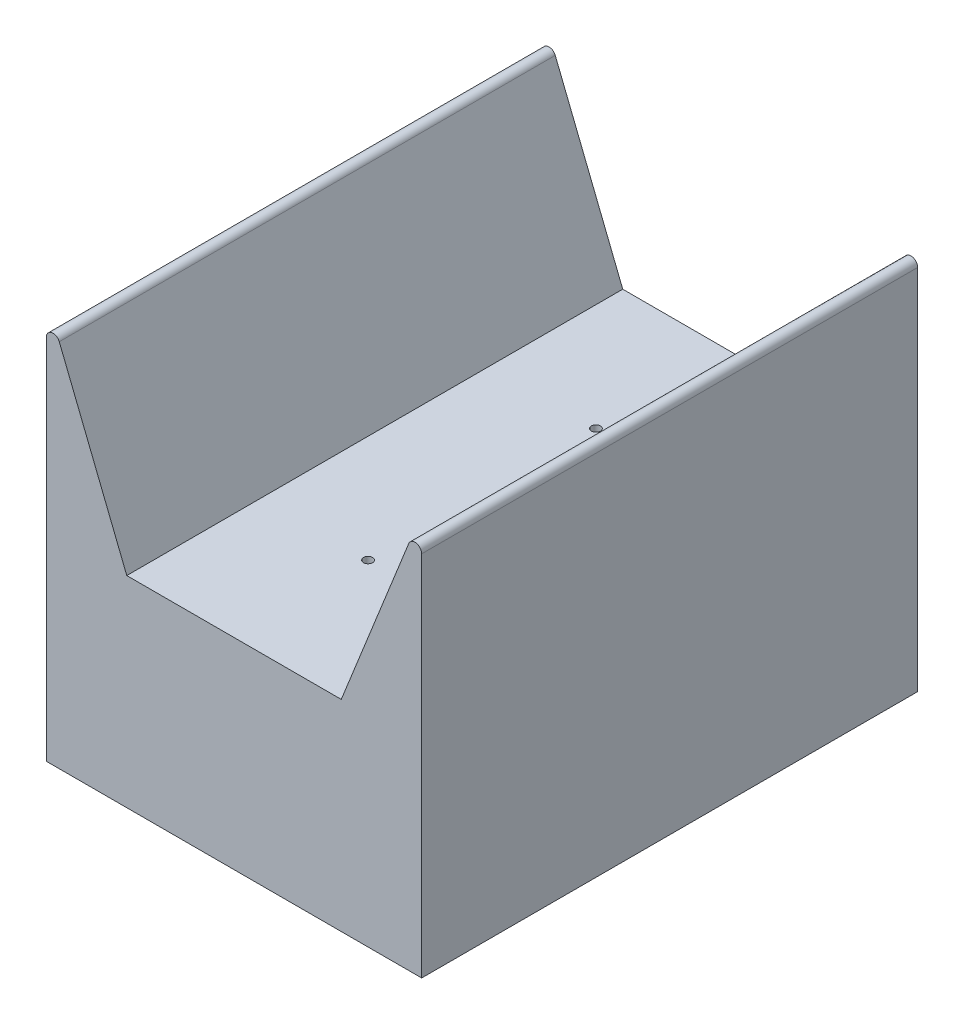
ISO-10303-21;
HEADER;
FILE_DESCRIPTION(('STEP AP214'),'2;1');
FILE_NAME('part.step','',(''),(''),'','','');
FILE_SCHEMA(('AUTOMOTIVE_DESIGN { 1 0 10303 214 1 1 1 1 }'));
ENDSEC;
DATA;
#1=APPLICATION_CONTEXT('core data for automotive mechanical design processes');
#2=APPLICATION_PROTOCOL_DEFINITION('international standard','automotive_design',2000,#1);
#3=PRODUCT_CONTEXT('',#1,'mechanical');
#4=PRODUCT('Part','Part','',(#3));
#5=PRODUCT_RELATED_PRODUCT_CATEGORY('part','',(#4));
#6=PRODUCT_DEFINITION_FORMATION('','',#4);
#7=PRODUCT_DEFINITION_CONTEXT('part definition',#1,'design');
#8=PRODUCT_DEFINITION('design','',#6,#7);
#9=PRODUCT_DEFINITION_SHAPE('','',#8);
#10=(LENGTH_UNIT() NAMED_UNIT(*) SI_UNIT(.MILLI.,.METRE.));
#11=(NAMED_UNIT(*) PLANE_ANGLE_UNIT() SI_UNIT($,.RADIAN.));
#12=(NAMED_UNIT(*) SI_UNIT($,.STERADIAN.) SOLID_ANGLE_UNIT());
#13=UNCERTAINTY_MEASURE_WITH_UNIT(LENGTH_MEASURE(1.E-05),#10,'distance_accuracy_value','');
#14=(GEOMETRIC_REPRESENTATION_CONTEXT(3) GLOBAL_UNCERTAINTY_ASSIGNED_CONTEXT((#13)) GLOBAL_UNIT_ASSIGNED_CONTEXT((#10,
#11,#12)) REPRESENTATION_CONTEXT('',''));
#15=CARTESIAN_POINT('',(0.,0.,0.));
#16=DIRECTION('',(0.,0.,1.));
#17=DIRECTION('',(1.,0.,0.));
#18=AXIS2_PLACEMENT_3D('',#15,#16,#17);
#19=CARTESIAN_POINT('',(0.,30.,18.5));
#20=DIRECTION('',(0.,0.,-1.));
#21=DIRECTION('',(-1.,0.,0.));
#22=AXIS2_PLACEMENT_3D('',#19,#20,#21);
#23=PLANE('',#22);
#24=DIRECTION('',(0.,-1.,0.));
#25=VECTOR('',#24,1.);
#26=CARTESIAN_POINT('',(14.,30.,18.5));
#27=LINE('',#26,#25);
#28=CARTESIAN_POINT('',(14.,27.4037087982164,18.5));
#29=VERTEX_POINT('',#28);
#30=CARTESIAN_POINT('',(14.,0.,18.5));
#31=VERTEX_POINT('',#30);
#32=EDGE_CURVE('E155',#29,#31,#27,.T.);
#33=ORIENTED_EDGE('',*,*,#32,.F.);
#34=CARTESIAN_POINT('',(13.5,27.4037087982164,18.5));
#35=DIRECTION('',(0.,0.,-1.));
#36=DIRECTION('',(-1.,0.,0.));
#37=AXIS2_PLACEMENT_3D('',#34,#35,#36);
#38=CIRCLE('',#37,0.5);
#39=CARTESIAN_POINT('',(13.0357616545574,27.5894041363934,18.5));
#40=VERTEX_POINT('',#39);
#41=EDGE_CURVE('E164',#29,#40,#38,.F.);
#42=ORIENTED_EDGE('',*,*,#41,.T.);
#43=DIRECTION('',(0.371390676354104,0.928476690885259,0.));
#44=VECTOR('',#43,1.);
#45=CARTESIAN_POINT('',(12.0689655172414,25.1724137931034,18.5));
#46=LINE('',#45,#44);
#47=CARTESIAN_POINT('',(8.,15.,18.5));
#48=VERTEX_POINT('',#47);
#49=EDGE_CURVE('E134',#48,#40,#46,.T.);
#50=ORIENTED_EDGE('',*,*,#49,.F.);
#51=DIRECTION('',(1.,0.,0.));
#52=VECTOR('',#51,1.);
#53=CARTESIAN_POINT('',(0.,15.,18.5));
#54=LINE('',#53,#52);
#55=CARTESIAN_POINT('',(-8.,15.,18.5));
#56=VERTEX_POINT('',#55);
#57=EDGE_CURVE('E137',#56,#48,#54,.T.);
#58=ORIENTED_EDGE('',*,*,#57,.F.);
#59=DIRECTION('',(-0.371390676354104,0.928476690885259,0.));
#60=VECTOR('',#59,1.);
#61=CARTESIAN_POINT('',(-12.0689655172414,25.1724137931034,18.5));
#62=LINE('',#61,#60);
#63=CARTESIAN_POINT('',(-13.0357616545574,27.5894041363934,18.5));
#64=VERTEX_POINT('',#63);
#65=EDGE_CURVE('E113',#56,#64,#62,.T.);
#66=ORIENTED_EDGE('',*,*,#65,.T.);
#67=CARTESIAN_POINT('',(-13.5,27.4037087982164,18.5));
#68=DIRECTION('',(0.,0.,-1.));
#69=DIRECTION('',(-1.,0.,0.));
#70=AXIS2_PLACEMENT_3D('',#67,#68,#69);
#71=CIRCLE('',#70,0.5);
#72=CARTESIAN_POINT('',(-14.,27.4037087982164,18.5));
#73=VERTEX_POINT('',#72);
#74=EDGE_CURVE('E162',#64,#73,#71,.F.);
#75=ORIENTED_EDGE('',*,*,#74,.T.);
#76=DIRECTION('',(0.,-1.,0.));
#77=VECTOR('',#76,1.);
#78=CARTESIAN_POINT('',(-14.,30.,18.5));
#79=LINE('',#78,#77);
#80=CARTESIAN_POINT('',(-14.,0.,18.5));
#81=VERTEX_POINT('',#80);
#82=EDGE_CURVE('E157',#73,#81,#79,.T.);
#83=ORIENTED_EDGE('',*,*,#82,.T.);
#84=DIRECTION('',(1.,0.,0.));
#85=VECTOR('',#84,1.);
#86=CARTESIAN_POINT('',(0.,0.,18.5));
#87=LINE('',#86,#85);
#88=EDGE_CURVE('E142',#81,#31,#87,.T.);
#89=ORIENTED_EDGE('',*,*,#88,.T.);
#90=EDGE_LOOP('',(#33,#42,#50,#58,#66,#75,#83,#89));
#91=FACE_BOUND('',#90,.T.);
#92=ADVANCED_FACE('F35',(#91),#23,.F.);
#93=CARTESIAN_POINT('',(0.,30.,-18.5));
#94=DIRECTION('',(0.,0.,1.));
#95=DIRECTION('',(1.,0.,0.));
#96=AXIS2_PLACEMENT_3D('',#93,#94,#95);
#97=PLANE('',#96);
#98=DIRECTION('',(0.371390676354104,0.928476690885259,0.));
#99=VECTOR('',#98,1.);
#100=CARTESIAN_POINT('',(1.72413793103449,-0.689655172413794,-18.5));
#101=LINE('',#100,#99);
#102=CARTESIAN_POINT('',(8.,15.,-18.5));
#103=VERTEX_POINT('',#102);
#104=CARTESIAN_POINT('',(13.0357616545574,27.5894041363934,-18.5));
#105=VERTEX_POINT('',#104);
#106=EDGE_CURVE('E117',#103,#105,#101,.T.);
#107=ORIENTED_EDGE('',*,*,#106,.T.);
#108=CARTESIAN_POINT('',(13.5,27.4037087982164,-18.5));
#109=DIRECTION('',(0.,0.,1.));
#110=DIRECTION('',(1.,0.,0.));
#111=AXIS2_PLACEMENT_3D('',#108,#109,#110);
#112=CIRCLE('',#111,0.5);
#113=CARTESIAN_POINT('',(14.,27.4037087982164,-18.5));
#114=VERTEX_POINT('',#113);
#115=EDGE_CURVE('E169',#105,#114,#112,.F.);
#116=ORIENTED_EDGE('',*,*,#115,.T.);
#117=DIRECTION('',(0.,-1.,0.));
#118=VECTOR('',#117,1.);
#119=CARTESIAN_POINT('',(14.,30.,-18.5));
#120=LINE('',#119,#118);
#121=CARTESIAN_POINT('',(14.,0.,-18.5));
#122=VERTEX_POINT('',#121);
#123=EDGE_CURVE('E153',#114,#122,#120,.T.);
#124=ORIENTED_EDGE('',*,*,#123,.T.);
#125=DIRECTION('',(-1.,0.,0.));
#126=VECTOR('',#125,1.);
#127=CARTESIAN_POINT('',(0.,0.,-18.5));
#128=LINE('',#127,#126);
#129=CARTESIAN_POINT('',(-14.,0.,-18.5));
#130=VERTEX_POINT('',#129);
#131=EDGE_CURVE('E148',#122,#130,#128,.T.);
#132=ORIENTED_EDGE('',*,*,#131,.T.);
#133=DIRECTION('',(0.,-1.,0.));
#134=VECTOR('',#133,1.);
#135=CARTESIAN_POINT('',(-14.,30.,-18.5));
#136=LINE('',#135,#134);
#137=CARTESIAN_POINT('',(-14.,27.4037087982164,-18.5));
#138=VERTEX_POINT('',#137);
#139=EDGE_CURVE('E151',#138,#130,#136,.T.);
#140=ORIENTED_EDGE('',*,*,#139,.F.);
#141=CARTESIAN_POINT('',(-13.5,27.4037087982164,-18.5));
#142=DIRECTION('',(0.,0.,1.));
#143=DIRECTION('',(1.,0.,0.));
#144=AXIS2_PLACEMENT_3D('',#141,#142,#143);
#145=CIRCLE('',#144,0.5);
#146=CARTESIAN_POINT('',(-13.0357616545574,27.5894041363934,-18.5));
#147=VERTEX_POINT('',#146);
#148=EDGE_CURVE('E57',#138,#147,#145,.F.);
#149=ORIENTED_EDGE('',*,*,#148,.T.);
#150=DIRECTION('',(-0.371390676354104,0.928476690885259,0.));
#151=VECTOR('',#150,1.);
#152=CARTESIAN_POINT('',(-1.72413793103448,-0.689655172413792,-18.5));
#153=LINE('',#152,#151);
#154=CARTESIAN_POINT('',(-8.,15.,-18.5));
#155=VERTEX_POINT('',#154);
#156=EDGE_CURVE('E110',#155,#147,#153,.T.);
#157=ORIENTED_EDGE('',*,*,#156,.F.);
#158=DIRECTION('',(1.,0.,0.));
#159=VECTOR('',#158,1.);
#160=CARTESIAN_POINT('',(0.,15.,-18.5));
#161=LINE('',#160,#159);
#162=EDGE_CURVE('E120',#155,#103,#161,.T.);
#163=ORIENTED_EDGE('',*,*,#162,.T.);
#164=EDGE_LOOP('',(#107,#116,#124,#132,#140,#149,#157,#163));
#165=FACE_BOUND('',#164,.T.);
#166=ADVANCED_FACE('F127',(#165),#97,.F.);
#167=CARTESIAN_POINT('',(-14.,30.,0.));
#168=DIRECTION('',(1.,0.,0.));
#169=DIRECTION('',(0.,0.,-1.));
#170=AXIS2_PLACEMENT_3D('',#167,#168,#169);
#171=PLANE('',#170);
#172=CARTESIAN_POINT('',(-14.,3.,-8.49999999999999));
#173=DIRECTION('',(-1.,0.,0.));
#174=DIRECTION('',(0.,0.,1.));
#175=AXIS2_PLACEMENT_3D('',#172,#173,#174);
#176=CIRCLE('',#175,1.5);
#177=CARTESIAN_POINT('',(-14.,3.,-6.99999999999999));
#178=VERTEX_POINT('',#177);
#179=EDGE_CURVE('E369',#178,#178,#176,.T.);
#180=ORIENTED_EDGE('',*,*,#179,.F.);
#181=EDGE_LOOP('',(#180));
#182=FACE_BOUND('',#181,.T.);
#183=CARTESIAN_POINT('',(-14.,3.,8.5));
#184=DIRECTION('',(-1.,0.,0.));
#185=DIRECTION('',(0.,0.,1.));
#186=AXIS2_PLACEMENT_3D('',#183,#184,#185);
#187=CIRCLE('',#186,1.5);
#188=CARTESIAN_POINT('',(-14.,3.,10.));
#189=VERTEX_POINT('',#188);
#190=EDGE_CURVE('E364',#189,#189,#187,.T.);
#191=ORIENTED_EDGE('',*,*,#190,.F.);
#192=EDGE_LOOP('',(#191));
#193=FACE_BOUND('',#192,.T.);
#194=ORIENTED_EDGE('',*,*,#82,.F.);
#195=DIRECTION('',(0.,0.,1.));
#196=VECTOR('',#195,1.);
#197=CARTESIAN_POINT('',(-14.,27.4037087982164,0.));
#198=LINE('',#197,#196);
#199=EDGE_CURVE('E11',#73,#138,#198,.F.);
#200=ORIENTED_EDGE('',*,*,#199,.T.);
#201=ORIENTED_EDGE('',*,*,#139,.T.);
#202=DIRECTION('',(0.,0.,1.));
#203=VECTOR('',#202,1.);
#204=CARTESIAN_POINT('',(-14.,0.,0.));
#205=LINE('',#204,#203);
#206=EDGE_CURVE('E139',#130,#81,#205,.T.);
#207=ORIENTED_EDGE('',*,*,#206,.T.);
#208=EDGE_LOOP('',(#194,#200,#201,#207));
#209=FACE_BOUND('',#208,.T.);
#210=ADVANCED_FACE('F207',(#182,#193,#209),#171,.F.);
#211=CARTESIAN_POINT('',(14.,30.,0.));
#212=DIRECTION('',(1.,0.,0.));
#213=DIRECTION('',(0.,0.,-1.));
#214=AXIS2_PLACEMENT_3D('',#211,#212,#213);
#215=PLANE('',#214);
#216=ORIENTED_EDGE('',*,*,#123,.F.);
#217=DIRECTION('',(0.,0.,1.));
#218=VECTOR('',#217,1.);
#219=CARTESIAN_POINT('',(14.,27.4037087982164,0.));
#220=LINE('',#219,#218);
#221=EDGE_CURVE('E159',#114,#29,#220,.T.);
#222=ORIENTED_EDGE('',*,*,#221,.T.);
#223=ORIENTED_EDGE('',*,*,#32,.T.);
#224=DIRECTION('',(0.,0.,1.));
#225=VECTOR('',#224,1.);
#226=CARTESIAN_POINT('',(14.,0.,0.));
#227=LINE('',#226,#225);
#228=EDGE_CURVE('E145',#122,#31,#227,.T.);
#229=ORIENTED_EDGE('',*,*,#228,.F.);
#230=EDGE_LOOP('',(#216,#222,#223,#229));
#231=FACE_BOUND('',#230,.T.);
#232=ADVANCED_FACE('F212',(#231),#215,.T.);
#233=CARTESIAN_POINT('',(0.,0.,0.));
#234=DIRECTION('',(0.,1.,0.));
#235=DIRECTION('',(0.,0.,1.));
#236=AXIS2_PLACEMENT_3D('',#233,#234,#235);
#237=PLANE('',#236);
#238=ORIENTED_EDGE('',*,*,#206,.F.);
#239=ORIENTED_EDGE('',*,*,#131,.F.);
#240=ORIENTED_EDGE('',*,*,#228,.T.);
#241=ORIENTED_EDGE('',*,*,#88,.F.);
#242=EDGE_LOOP('',(#238,#239,#240,#241));
#243=FACE_BOUND('',#242,.T.);
#244=ADVANCED_FACE('F236',(#243),#237,.F.);
#245=CARTESIAN_POINT('',(0.,15.,21.5));
#246=DIRECTION('',(0.,1.,0.));
#247=DIRECTION('',(-1.,0.,0.));
#248=AXIS2_PLACEMENT_3D('',#245,#246,#247);
#249=PLANE('',#248);
#250=CARTESIAN_POINT('',(0.,15.,-8.49999999999999));
#251=DIRECTION('',(0.,1.,0.));
#252=DIRECTION('',(-1.,0.,0.));
#253=AXIS2_PLACEMENT_3D('',#250,#251,#252);
#254=CIRCLE('',#253,0.34);
#255=CARTESIAN_POINT('',(-0.339999999999998,15.,-8.49999999999999));
#256=VERTEX_POINT('',#255);
#257=EDGE_CURVE('E125',#256,#256,#254,.T.);
#258=ORIENTED_EDGE('',*,*,#257,.F.);
#259=EDGE_LOOP('',(#258));
#260=FACE_BOUND('',#259,.T.);
#261=CARTESIAN_POINT('',(0.,15.,8.5));
#262=DIRECTION('',(0.,1.,0.));
#263=DIRECTION('',(-1.,0.,0.));
#264=AXIS2_PLACEMENT_3D('',#261,#262,#263);
#265=CIRCLE('',#264,0.34);
#266=CARTESIAN_POINT('',(-0.339999999999998,15.,8.5));
#267=VERTEX_POINT('',#266);
#268=EDGE_CURVE('E360',#267,#267,#265,.T.);
#269=ORIENTED_EDGE('',*,*,#268,.F.);
#270=EDGE_LOOP('',(#269));
#271=FACE_BOUND('',#270,.T.);
#272=ORIENTED_EDGE('',*,*,#57,.T.);
#273=DIRECTION('',(0.,0.,-1.));
#274=VECTOR('',#273,1.);
#275=CARTESIAN_POINT('',(8.,15.,21.5));
#276=LINE('',#275,#274);
#277=EDGE_CURVE('E116',#48,#103,#276,.T.);
#278=ORIENTED_EDGE('',*,*,#277,.T.);
#279=ORIENTED_EDGE('',*,*,#162,.F.);
#280=DIRECTION('',(0.,0.,-1.));
#281=VECTOR('',#280,1.);
#282=CARTESIAN_POINT('',(-8.,15.,21.5));
#283=LINE('',#282,#281);
#284=EDGE_CURVE('E106',#56,#155,#283,.T.);
#285=ORIENTED_EDGE('',*,*,#284,.F.);
#286=EDGE_LOOP('',(#272,#278,#279,#285));
#287=FACE_BOUND('',#286,.T.);
#288=ADVANCED_FACE('F121',(#260,#271,#287),#249,.T.);
#289=CARTESIAN_POINT('',(1.72413793103449,-0.689655172413794,21.5));
#290=DIRECTION('',(-0.928476690885259,0.371390676354104,0.));
#291=DIRECTION('',(-0.371390676354104,-0.928476690885259,0.));
#292=AXIS2_PLACEMENT_3D('',#289,#290,#291);
#293=PLANE('',#292);
#294=ORIENTED_EDGE('',*,*,#49,.T.);
#295=DIRECTION('',(0.,0.,1.));
#296=VECTOR('',#295,1.);
#297=CARTESIAN_POINT('',(13.0357616545574,27.5894041363934,21.5));
#298=LINE('',#297,#296);
#299=EDGE_CURVE('E166',#40,#105,#298,.F.);
#300=ORIENTED_EDGE('',*,*,#299,.T.);
#301=ORIENTED_EDGE('',*,*,#106,.F.);
#302=ORIENTED_EDGE('',*,*,#277,.F.);
#303=EDGE_LOOP('',(#294,#300,#301,#302));
#304=FACE_BOUND('',#303,.T.);
#305=ADVANCED_FACE('F224',(#304),#293,.T.);
#306=CARTESIAN_POINT('',(-1.72413793103448,-0.689655172413792,21.5));
#307=DIRECTION('',(-0.928476690885259,-0.371390676354104,0.));
#308=DIRECTION('',(0.371390676354104,-0.928476690885259,0.));
#309=AXIS2_PLACEMENT_3D('',#306,#307,#308);
#310=PLANE('',#309);
#311=ORIENTED_EDGE('',*,*,#156,.T.);
#312=DIRECTION('',(0.,0.,1.));
#313=VECTOR('',#312,1.);
#314=CARTESIAN_POINT('',(-13.0357616545574,27.5894041363934,21.5));
#315=LINE('',#314,#313);
#316=EDGE_CURVE('E49',#147,#64,#315,.T.);
#317=ORIENTED_EDGE('',*,*,#316,.T.);
#318=ORIENTED_EDGE('',*,*,#65,.F.);
#319=ORIENTED_EDGE('',*,*,#284,.T.);
#320=EDGE_LOOP('',(#311,#317,#318,#319));
#321=FACE_BOUND('',#320,.T.);
#322=ADVANCED_FACE('F108',(#321),#310,.F.);
#323=CARTESIAN_POINT('',(13.5,27.4037087982164,0.));
#324=DIRECTION('',(0.,0.,1.));
#325=DIRECTION('',(0.,-1.,0.));
#326=AXIS2_PLACEMENT_3D('',#323,#324,#325);
#327=CYLINDRICAL_SURFACE('',#326,0.5);
#328=ORIENTED_EDGE('',*,*,#115,.F.);
#329=ORIENTED_EDGE('',*,*,#299,.F.);
#330=ORIENTED_EDGE('',*,*,#41,.F.);
#331=ORIENTED_EDGE('',*,*,#221,.F.);
#332=EDGE_LOOP('',(#328,#329,#330,#331));
#333=FACE_BOUND('',#332,.T.);
#334=ADVANCED_FACE('F215',(#333),#327,.T.);
#335=CARTESIAN_POINT('',(-13.5,27.4037087982164,21.5));
#336=DIRECTION('',(0.,0.,1.));
#337=DIRECTION('',(0.,-1.,0.));
#338=AXIS2_PLACEMENT_3D('',#335,#336,#337);
#339=CYLINDRICAL_SURFACE('',#338,0.5);
#340=ORIENTED_EDGE('',*,*,#148,.F.);
#341=ORIENTED_EDGE('',*,*,#199,.F.);
#342=ORIENTED_EDGE('',*,*,#74,.F.);
#343=ORIENTED_EDGE('',*,*,#316,.F.);
#344=EDGE_LOOP('',(#340,#341,#342,#343));
#345=FACE_BOUND('',#344,.T.);
#346=ADVANCED_FACE('F37',(#345),#339,.T.);
#347=CARTESIAN_POINT('',(0.,2.99999999999999,8.5));
#348=DIRECTION('',(0.,1.,0.));
#349=DIRECTION('',(-1.,0.,0.));
#350=AXIS2_PLACEMENT_3D('',#347,#348,#349);
#351=CYLINDRICAL_SURFACE('',#350,0.34);
#352=CARTESIAN_POINT('',(-0.339999999999999,4.5,8.5));
#353=CARTESIAN_POINT('',(-0.339999381612707,4.49999965600724,8.48116015838987));
#354=CARTESIAN_POINT('',(-0.338428806643866,4.49964147030132,8.46231298968047));
#355=CARTESIAN_POINT('',(-0.332195220373856,4.49824721777353,8.42515517067573));
#356=CARTESIAN_POINT('',(-0.327530110190907,4.49721069087026,8.40684489333692));
#357=CARTESIAN_POINT('',(-0.31526200372305,4.49457501356346,8.37130313174163));
#358=CARTESIAN_POINT('',(-0.307662189019575,4.4929764726199,8.35407050260954));
#359=CARTESIAN_POINT('',(-0.289750775237162,4.4893887380593,8.3211253254099));
#360=CARTESIAN_POINT('',(-0.279439206263035,4.48739954877915,8.30541276046985));
#361=CARTESIAN_POINT('',(-0.256209848959288,4.48320979779247,8.27568370416835));
#362=CARTESIAN_POINT('',(-0.243254407437291,4.48100645513996,8.26169702340486));
#363=CARTESIAN_POINT('',(-0.215185844443778,4.4766560450023,8.23607540321447));
#364=CARTESIAN_POINT('',(-0.200072519244338,4.47450898285332,8.22444068608963));
#365=CARTESIAN_POINT('',(-0.167894112626366,4.47048667376725,8.20371964448759));
#366=CARTESIAN_POINT('',(-0.150807860112789,4.46861498281201,8.19466544512782));
#367=CARTESIAN_POINT('',(-0.115306825356813,4.46539541701119,8.17956864479911));
#368=CARTESIAN_POINT('',(-0.0968922150069993,4.464047474535,8.1735256549701));
#369=CARTESIAN_POINT('',(-0.0595816769381767,4.46205641526193,8.16472210661427));
#370=CARTESIAN_POINT('',(-0.0406988708306603,4.4614019351497,8.16190856316575));
#371=CARTESIAN_POINT('',(-0.00271878829099321,4.46083780426565,8.15947895028389));
#372=CARTESIAN_POINT('',(0.0163784594179964,4.46092805490252,8.15986245760851));
#373=CARTESIAN_POINT('',(0.05384853603505,4.46183291810618,8.16377350956722));
#374=CARTESIAN_POINT('',(0.0722282259080608,4.46263326246298,8.1672391273052));
#375=CARTESIAN_POINT('',(0.108138332152136,4.46484553266293,8.17711774969167));
#376=CARTESIAN_POINT('',(0.125668697662057,4.46625749508214,8.18353093061217));
#377=CARTESIAN_POINT('',(0.159554668079352,4.4695477337426,8.19917849171316));
#378=CARTESIAN_POINT('',(0.175899038055228,4.47142986649984,8.20843635723485));
#379=CARTESIAN_POINT('',(0.206825036398455,4.47544605847378,8.22949400040338));
#380=CARTESIAN_POINT('',(0.221406407266717,4.47758015440182,8.24129414867097));
#381=CARTESIAN_POINT('',(0.248748645928623,4.48192075992611,8.26742750602638));
#382=CARTESIAN_POINT('',(0.261459241021979,4.48412779884108,8.28181328076457));
#383=CARTESIAN_POINT('',(0.284296027055339,4.48832048711815,8.31253762535503));
#384=CARTESIAN_POINT('',(0.294422164217828,4.49030613187298,8.3288762358316));
#385=CARTESIAN_POINT('',(0.31181644797071,4.49383951689069,8.363106318455));
#386=CARTESIAN_POINT('',(0.319077626842905,4.49538618701545,8.38100144882536));
#387=CARTESIAN_POINT('',(0.330475659014408,4.49785945464573,8.41780081541546));
#388=CARTESIAN_POINT('',(0.334613001038043,4.49878614914387,8.43670489328965));
#389=CARTESIAN_POINT('',(0.339571913801517,4.49990111325908,8.47455465822846));
#390=CARTESIAN_POINT('',(0.340462104053483,4.50010466209805,8.49349091728475));
#391=CARTESIAN_POINT('',(0.339087969487791,4.49979338657816,8.53124160295119));
#392=CARTESIAN_POINT('',(0.336823875331668,4.49927861474752,8.55005603836881));
#393=CARTESIAN_POINT('',(0.329262273533947,4.49759821803268,8.58679895916791));
#394=CARTESIAN_POINT('',(0.324001107449065,4.49644039472652,8.60473531214768));
#395=CARTESIAN_POINT('',(0.310635327234665,4.49360365249418,8.63947073975794));
#396=CARTESIAN_POINT('',(0.302530458900206,4.49192468698347,8.65626971255525));
#397=CARTESIAN_POINT('',(0.283566807882245,4.48819443730154,8.68853468634087));
#398=CARTESIAN_POINT('',(0.27266816653604,4.48613789823333,8.70397663918629));
#399=CARTESIAN_POINT('',(0.248478445650277,4.48189070532671,8.73283706095738));
#400=CARTESIAN_POINT('',(0.235187030780707,4.47970003271887,8.7462552457815));
#401=CARTESIAN_POINT('',(0.206273173391707,4.47537814720754,8.77096136798769));
#402=CARTESIAN_POINT('',(0.190609623477262,4.47324898373614,8.78220162413523));
#403=CARTESIAN_POINT('',(0.157577037932904,4.46934068378681,8.801892588147));
#404=CARTESIAN_POINT('',(0.140208077646606,4.46756153185607,8.81034341917382));
#405=CARTESIAN_POINT('',(0.104352103224744,4.46457244639107,8.82415664492429));
#406=CARTESIAN_POINT('',(0.0858722243793697,4.46335924370583,8.82953681839344));
#407=CARTESIAN_POINT('',(0.0482394023860601,4.4616340775949,8.83710706826217));
#408=CARTESIAN_POINT('',(0.029086576706924,4.46112199240058,8.83929769861908));
#409=CARTESIAN_POINT('',(-0.00886670035121975,4.46086511352421,8.84040176184977));
#410=CARTESIAN_POINT('',(-0.0276648676043365,4.4611025878912,8.83939092818941));
#411=CARTESIAN_POINT('',(-0.0648154439940772,4.46227775155912,8.8342910382957));
#412=CARTESIAN_POINT('',(-0.0831678592062711,4.46321543131075,8.83020202404207));
#413=CARTESIAN_POINT('',(-0.118840444140332,4.46567639883675,8.81909963955215));
#414=CARTESIAN_POINT('',(-0.136164459102243,4.4671973225451,8.8120980652244));
#415=CARTESIAN_POINT('',(-0.169402899967106,4.47065417322627,8.79537916817129));
#416=CARTESIAN_POINT('',(-0.185317166423283,4.47259014705804,8.78566153876712));
#417=CARTESIAN_POINT('',(-0.215655949680256,4.47671135014919,8.76353853542049));
#418=CARTESIAN_POINT('',(-0.230040752403457,4.4789010684773,8.75107952499189));
#419=CARTESIAN_POINT('',(-0.256540247118153,4.48325373316697,8.72393513891278));
#420=CARTESIAN_POINT('',(-0.268654411100604,4.48541667319264,8.70924924686108));
#421=CARTESIAN_POINT('',(-0.290433795645801,4.48950846735948,8.6778172200614));
#422=CARTESIAN_POINT('',(-0.300061912322588,4.4914335733862,8.66104485812347));
#423=CARTESIAN_POINT('',(-0.316346882462666,4.4947947841689,8.62607915432064));
#424=CARTESIAN_POINT('',(-0.323006141901601,4.49623128466842,8.6078869771827));
#425=CARTESIAN_POINT('',(-0.332024767941531,4.49820757779377,8.57473992672679));
#426=CARTESIAN_POINT('',(-0.335009597269806,4.4988754659549,8.55995966494532));
#427=CARTESIAN_POINT('',(-0.338997410167138,4.49977180341141,8.53012115392611));
#428=CARTESIAN_POINT('',(-0.340000494415919,4.50000027503071,8.51506291884964));
#429=CARTESIAN_POINT('',(-0.339999999999999,4.5,8.5));
#430=B_SPLINE_CURVE_WITH_KNOTS('',3,(#352,#353,#354,#355,#356,#357,#358,#359,#360,#361,#362,
#363,#364,#365,#366,#367,#368,#369,#370,#371,#372,#373,#374,#375,#376,#377,#378,#379,#380,#381,
#382,#383,#384,#385,#386,#387,#388,#389,#390,#391,#392,#393,#394,#395,#396,#397,#398,#399,#400,
#401,#402,#403,#404,#405,#406,#407,#408,#409,#410,#411,#412,#413,#414,#415,#416,#417,#418,#419,
#420,#421,#422,#423,#424,#425,#426,#427,#428,#429),.UNSPECIFIED.,.T.,.F.,(4,2,2,2,2,2,2,2,2,2,2,
2,2,2,2,2,2,2,2,2,2,2,2,2,2,2,2,2,2,2,2,2,2,2,2,2,2,2,4),(0.,0.0564643735464972,
0.112967083508618,0.169408708768699,0.225849707462903,0.283158982808127,0.340473672360604,
0.398473482500616,0.456465800747878,0.513492402098165,0.570511454093271,0.626410109112225,
0.682312107452463,0.73868862353023,0.795073363894466,0.852770490426657,0.910468817425354,
0.968306617143605,1.02613536626108,1.0827347453872,1.13932998582044,1.19525314862712,
1.25118131180533,1.30795672221694,1.36474009549709,1.42265293731896,1.48056322174981,
1.53813471936139,1.59569621680719,1.65190630472945,1.7081156260816,1.76409948173102,
1.82008966125906,1.87729206987514,1.93450776374837,1.99253358859542,2.05051230318391,
2.09565925860418,2.14080392033896),.UNSPECIFIED.);
#431=CARTESIAN_POINT('',(-0.339999999999999,4.5,8.5));
#432=VERTEX_POINT('',#431);
#433=EDGE_CURVE('E39',#432,#432,#430,.T.);
#434=ORIENTED_EDGE('',*,*,#433,.T.);
#435=EDGE_LOOP('',(#434));
#436=FACE_BOUND('',#435,.T.);
#437=ORIENTED_EDGE('',*,*,#268,.T.);
#438=EDGE_LOOP('',(#437));
#439=FACE_BOUND('',#438,.T.);
#440=ADVANCED_FACE('F222',(#436,#439),#351,.F.);
#441=CARTESIAN_POINT('',(0.,2.99999999999999,-8.49999999999999));
#442=DIRECTION('',(0.,1.,0.));
#443=DIRECTION('',(-1.,0.,0.));
#444=AXIS2_PLACEMENT_3D('',#441,#442,#443);
#445=CYLINDRICAL_SURFACE('',#444,0.34);
#446=CARTESIAN_POINT('',(-0.339999999999999,4.5,-8.49999999999999));
#447=CARTESIAN_POINT('',(-0.339999381612706,4.49999965600724,-8.51883984161013));
#448=CARTESIAN_POINT('',(-0.338428806643866,4.49964147030132,-8.53768701031953));
#449=CARTESIAN_POINT('',(-0.332195220373856,4.49824721777353,-8.57484482932426));
#450=CARTESIAN_POINT('',(-0.327530110190907,4.49721069087026,-8.59315510666308));
#451=CARTESIAN_POINT('',(-0.31526200372305,4.49457501356346,-8.62869686825837));
#452=CARTESIAN_POINT('',(-0.307662189019575,4.4929764726199,-8.64592949739046));
#453=CARTESIAN_POINT('',(-0.289750775237162,4.48938873805931,-8.6788746745901));
#454=CARTESIAN_POINT('',(-0.279439206263035,4.48739954877916,-8.69458723953015));
#455=CARTESIAN_POINT('',(-0.256209848959288,4.48320979779248,-8.72431629583164));
#456=CARTESIAN_POINT('',(-0.243254407437291,4.48100645513996,-8.73830297659514));
#457=CARTESIAN_POINT('',(-0.215185844443778,4.4766560450023,-8.76392459678552));
#458=CARTESIAN_POINT('',(-0.200072519244338,4.47450898285333,-8.77555931391037));
#459=CARTESIAN_POINT('',(-0.167894112626366,4.47048667376725,-8.79628035551241));
#460=CARTESIAN_POINT('',(-0.150807860112788,4.46861498281201,-8.80533455487218));
#461=CARTESIAN_POINT('',(-0.115306825356813,4.46539541701119,-8.82043135520088));
#462=CARTESIAN_POINT('',(-0.0968922150069992,4.464047474535,-8.82647434502989));
#463=CARTESIAN_POINT('',(-0.0595816769381767,4.46205641526193,-8.83527789338573));
#464=CARTESIAN_POINT('',(-0.0406988708306604,4.4614019351497,-8.83809143683425));
#465=CARTESIAN_POINT('',(-0.00271878829099334,4.46083780426565,-8.84052104971611));
#466=CARTESIAN_POINT('',(0.0163784594179963,4.46092805490252,-8.84013754239149));
#467=CARTESIAN_POINT('',(0.05384853603505,4.46183291810618,-8.83622649043278));
#468=CARTESIAN_POINT('',(0.0722282259080607,4.46263326246299,-8.8327608726948));
#469=CARTESIAN_POINT('',(0.108138332152136,4.46484553266293,-8.82288225030832));
#470=CARTESIAN_POINT('',(0.125668697662057,4.46625749508214,-8.81646906938782));
#471=CARTESIAN_POINT('',(0.159554668079352,4.4695477337426,-8.80082150828683));
#472=CARTESIAN_POINT('',(0.175899038055228,4.47142986649984,-8.79156364276515));
#473=CARTESIAN_POINT('',(0.206825036398455,4.47544605847378,-8.77050599959661));
#474=CARTESIAN_POINT('',(0.221406407266717,4.47758015440182,-8.75870585132903));
#475=CARTESIAN_POINT('',(0.248748645928623,4.48192075992611,-8.73257249397362));
#476=CARTESIAN_POINT('',(0.261459241021979,4.48412779884108,-8.71818671923543));
#477=CARTESIAN_POINT('',(0.284296027055339,4.48832048711815,-8.68746237464496));
#478=CARTESIAN_POINT('',(0.294422164217828,4.49030613187298,-8.67112376416839));
#479=CARTESIAN_POINT('',(0.311816447970709,4.49383951689069,-8.63689368154499));
#480=CARTESIAN_POINT('',(0.319077626842905,4.49538618701545,-8.61899855117464));
#481=CARTESIAN_POINT('',(0.330475659014408,4.49785945464573,-8.58219918458454));
#482=CARTESIAN_POINT('',(0.334613001038042,4.49878614914387,-8.56329510671035));
#483=CARTESIAN_POINT('',(0.339571913801517,4.49990111325908,-8.52544534177154));
#484=CARTESIAN_POINT('',(0.340462104053483,4.50010466209805,-8.50650908271525));
#485=CARTESIAN_POINT('',(0.339087969487791,4.49979338657816,-8.46875839704881));
#486=CARTESIAN_POINT('',(0.336823875331669,4.49927861474752,-8.44994396163119));
#487=CARTESIAN_POINT('',(0.329262273533947,4.49759821803268,-8.41320104083208));
#488=CARTESIAN_POINT('',(0.324001107449065,4.49644039472652,-8.39526468785232));
#489=CARTESIAN_POINT('',(0.310635327234665,4.49360365249418,-8.36052926024206));
#490=CARTESIAN_POINT('',(0.302530458900206,4.49192468698347,-8.34373028744475));
#491=CARTESIAN_POINT('',(0.283566807882245,4.48819443730154,-8.31146531365913));
#492=CARTESIAN_POINT('',(0.27266816653604,4.48613789823333,-8.2960233608137));
#493=CARTESIAN_POINT('',(0.248478445650277,4.48189070532671,-8.26716293904262));
#494=CARTESIAN_POINT('',(0.235187030780707,4.47970003271887,-8.2537447542185));
#495=CARTESIAN_POINT('',(0.206273173391707,4.47537814720754,-8.22903863201231));
#496=CARTESIAN_POINT('',(0.190609623477261,4.47324898373614,-8.21779837586477));
#497=CARTESIAN_POINT('',(0.157577037932903,4.46934068378681,-8.198107411853));
#498=CARTESIAN_POINT('',(0.140208077646606,4.46756153185607,-8.18965658082618));
#499=CARTESIAN_POINT('',(0.104352103224745,4.46457244639107,-8.17584335507571));
#500=CARTESIAN_POINT('',(0.08587222437937,4.46335924370584,-8.17046318160655));
#501=CARTESIAN_POINT('',(0.0482394023860604,4.4616340775949,-8.16289293173783));
#502=CARTESIAN_POINT('',(0.0290865767069244,4.46112199240058,-8.16070230138092));
#503=CARTESIAN_POINT('',(-0.00886670035121942,4.46086511352421,-8.15959823815023));
#504=CARTESIAN_POINT('',(-0.0276648676043361,4.46110258789121,-8.16060907181058));
#505=CARTESIAN_POINT('',(-0.0648154439940768,4.46227775155912,-8.1657089617043));
#506=CARTESIAN_POINT('',(-0.0831678592062707,4.46321543131075,-8.16979797595793));
#507=CARTESIAN_POINT('',(-0.118840444140332,4.46567639883675,-8.18090036044785));
#508=CARTESIAN_POINT('',(-0.136164459102243,4.4671973225451,-8.1879019347756));
#509=CARTESIAN_POINT('',(-0.169402899967106,4.47065417322627,-8.20462083182871));
#510=CARTESIAN_POINT('',(-0.185317166423282,4.47259014705804,-8.21433846123287));
#511=CARTESIAN_POINT('',(-0.215655949680254,4.47671135014919,-8.2364614645795));
#512=CARTESIAN_POINT('',(-0.230040752403454,4.4789010684773,-8.2489204750081));
#513=CARTESIAN_POINT('',(-0.256540247118151,4.48325373316697,-8.27606486108721));
#514=CARTESIAN_POINT('',(-0.268654411100603,4.48541667319264,-8.29075075313892));
#515=CARTESIAN_POINT('',(-0.290433795645801,4.48950846735949,-8.3221827799386));
#516=CARTESIAN_POINT('',(-0.300061912322588,4.4914335733862,-8.33895514187653));
#517=CARTESIAN_POINT('',(-0.316346882462666,4.49479478416891,-8.37392084567936));
#518=CARTESIAN_POINT('',(-0.323006141901601,4.49623128466842,-8.3921130228173));
#519=CARTESIAN_POINT('',(-0.332024767941531,4.49820757779377,-8.42526007327321));
#520=CARTESIAN_POINT('',(-0.335009597269806,4.4988754659549,-8.44004033505468));
#521=CARTESIAN_POINT('',(-0.338997410167138,4.49977180341142,-8.46987884607389));
#522=CARTESIAN_POINT('',(-0.340000494415919,4.50000027503071,-8.48493708115036));
#523=CARTESIAN_POINT('',(-0.339999999999999,4.5,-8.49999999999999));
#524=B_SPLINE_CURVE_WITH_KNOTS('',3,(#446,#447,#448,#449,#450,#451,#452,#453,#454,#455,#456,
#457,#458,#459,#460,#461,#462,#463,#464,#465,#466,#467,#468,#469,#470,#471,#472,#473,#474,#475,
#476,#477,#478,#479,#480,#481,#482,#483,#484,#485,#486,#487,#488,#489,#490,#491,#492,#493,#494,
#495,#496,#497,#498,#499,#500,#501,#502,#503,#504,#505,#506,#507,#508,#509,#510,#511,#512,#513,
#514,#515,#516,#517,#518,#519,#520,#521,#522,#523),.UNSPECIFIED.,.T.,.F.,(4,2,2,2,2,2,2,2,2,2,2,
2,2,2,2,2,2,2,2,2,2,2,2,2,2,2,2,2,2,2,2,2,2,2,2,2,2,2,4),(0.,0.0564643735464972,
0.112967083508618,0.169408708768699,0.225849707462903,0.283158982808127,0.340473672360604,
0.398473482500616,0.456465800747878,0.513492402098165,0.570511454093271,0.626410109112225,
0.682312107452463,0.73868862353023,0.795073363894466,0.852770490426657,0.910468817425354,
0.968306617143603,1.02613536626108,1.0827347453872,1.13932998582044,1.19525314862712,
1.25118131180533,1.30795672221694,1.36474009549709,1.42265293731896,1.48056322174981,
1.53813471936139,1.59569621680719,1.65190630472945,1.7081156260816,1.76409948173102,
1.82008966125906,1.87729206987513,1.93450776374837,1.99253358859542,2.05051230318391,
2.09565925860418,2.14080392033896),.UNSPECIFIED.);
#525=CARTESIAN_POINT('',(-0.339999999999999,4.5,-8.49999999999999));
#526=VERTEX_POINT('',#525);
#527=EDGE_CURVE('E171',#526,#526,#524,.T.);
#528=ORIENTED_EDGE('',*,*,#527,.T.);
#529=EDGE_LOOP('',(#528));
#530=FACE_BOUND('',#529,.T.);
#531=ORIENTED_EDGE('',*,*,#257,.T.);
#532=EDGE_LOOP('',(#531));
#533=FACE_BOUND('',#532,.T.);
#534=ADVANCED_FACE('F179',(#530,#533),#445,.F.);
#535=CARTESIAN_POINT('',(2.,3.,-8.49999999999999));
#536=DIRECTION('',(-1.,0.,0.));
#537=DIRECTION('',(0.,0.,1.));
#538=AXIS2_PLACEMENT_3D('',#535,#536,#537);
#539=CYLINDRICAL_SURFACE('',#538,1.5);
#540=ORIENTED_EDGE('',*,*,#179,.T.);
#541=EDGE_LOOP('',(#540));
#542=FACE_BOUND('',#541,.T.);
#543=CARTESIAN_POINT('',(2.,3.,-8.49999999999999));
#544=DIRECTION('',(-1.,0.,0.));
#545=DIRECTION('',(0.,0.,1.));
#546=AXIS2_PLACEMENT_3D('',#543,#544,#545);
#547=CIRCLE('',#546,1.5);
#548=CARTESIAN_POINT('',(2.,3.,-7.));
#549=VERTEX_POINT('',#548);
#550=EDGE_CURVE('E178',#549,#549,#547,.T.);
#551=ORIENTED_EDGE('',*,*,#550,.F.);
#552=EDGE_LOOP('',(#551));
#553=FACE_BOUND('',#552,.T.);
#554=ORIENTED_EDGE('',*,*,#527,.F.);
#555=EDGE_LOOP('',(#554));
#556=FACE_BOUND('',#555,.T.);
#557=ADVANCED_FACE('F181',(#542,#553,#556),#539,.F.);
#558=CARTESIAN_POINT('',(2.,3.,-8.49999999999999));
#559=DIRECTION('',(-1.,0.,0.));
#560=DIRECTION('',(0.,0.,1.));
#561=AXIS2_PLACEMENT_3D('',#558,#559,#560);
#562=PLANE('',#561);
#563=ORIENTED_EDGE('',*,*,#550,.T.);
#564=EDGE_LOOP('',(#563));
#565=FACE_BOUND('',#564,.T.);
#566=ADVANCED_FACE('F186',(#565),#562,.T.);
#567=CARTESIAN_POINT('',(2.,3.,8.5));
#568=DIRECTION('',(-1.,0.,0.));
#569=DIRECTION('',(0.,0.,1.));
#570=AXIS2_PLACEMENT_3D('',#567,#568,#569);
#571=CYLINDRICAL_SURFACE('',#570,1.5);
#572=ORIENTED_EDGE('',*,*,#190,.T.);
#573=EDGE_LOOP('',(#572));
#574=FACE_BOUND('',#573,.T.);
#575=CARTESIAN_POINT('',(2.,3.,8.5));
#576=DIRECTION('',(-1.,0.,0.));
#577=DIRECTION('',(0.,0.,1.));
#578=AXIS2_PLACEMENT_3D('',#575,#576,#577);
#579=CIRCLE('',#578,1.5);
#580=CARTESIAN_POINT('',(2.,3.,10.));
#581=VERTEX_POINT('',#580);
#582=EDGE_CURVE('E366',#581,#581,#579,.T.);
#583=ORIENTED_EDGE('',*,*,#582,.F.);
#584=EDGE_LOOP('',(#583));
#585=FACE_BOUND('',#584,.T.);
#586=ORIENTED_EDGE('',*,*,#433,.F.);
#587=EDGE_LOOP('',(#586));
#588=FACE_BOUND('',#587,.T.);
#589=ADVANCED_FACE('F190',(#574,#585,#588),#571,.F.);
#590=CARTESIAN_POINT('',(2.,3.,8.5));
#591=DIRECTION('',(-1.,0.,0.));
#592=DIRECTION('',(0.,0.,1.));
#593=AXIS2_PLACEMENT_3D('',#590,#591,#592);
#594=PLANE('',#593);
#595=ORIENTED_EDGE('',*,*,#582,.T.);
#596=EDGE_LOOP('',(#595));
#597=FACE_BOUND('',#596,.T.);
#598=ADVANCED_FACE('F188',(#597),#594,.T.);
#599=CLOSED_SHELL('',(#92,#166,#210,#232,#244,#288,#305,#322,#334,#346,#440,#534,#557,#566,#589,#598));
#600=MANIFOLD_SOLID_BREP('B2',#599);
#601=ADVANCED_BREP_SHAPE_REPRESENTATION('',(#18,#600),#14);
#602=SHAPE_DEFINITION_REPRESENTATION(#9,#601);
ENDSEC;
END-ISO-10303-21;
